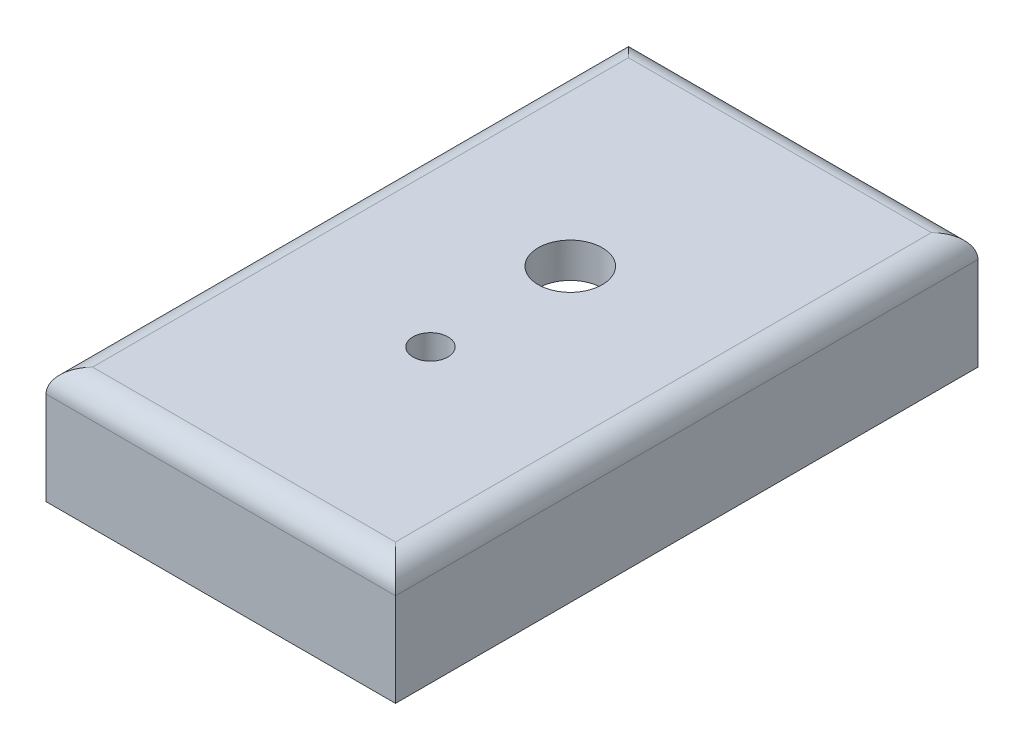
ISO-10303-21;
HEADER;
FILE_DESCRIPTION(('STEP AP214'),'2;1');
FILE_NAME('part.step','',(''),(''),'','','');
FILE_SCHEMA(('AUTOMOTIVE_DESIGN { 1 0 10303 214 1 1 1 1 }'));
ENDSEC;
DATA;
#1=APPLICATION_CONTEXT('core data for automotive mechanical design processes');
#2=APPLICATION_PROTOCOL_DEFINITION('international standard','automotive_design',2000,#1);
#3=PRODUCT_CONTEXT('',#1,'mechanical');
#4=PRODUCT('Part','Part','',(#3));
#5=PRODUCT_RELATED_PRODUCT_CATEGORY('part','',(#4));
#6=PRODUCT_DEFINITION_FORMATION('','',#4);
#7=PRODUCT_DEFINITION_CONTEXT('part definition',#1,'design');
#8=PRODUCT_DEFINITION('design','',#6,#7);
#9=PRODUCT_DEFINITION_SHAPE('','',#8);
#10=(LENGTH_UNIT() NAMED_UNIT(*) SI_UNIT(.MILLI.,.METRE.));
#11=(NAMED_UNIT(*) PLANE_ANGLE_UNIT() SI_UNIT($,.RADIAN.));
#12=(NAMED_UNIT(*) SI_UNIT($,.STERADIAN.) SOLID_ANGLE_UNIT());
#13=UNCERTAINTY_MEASURE_WITH_UNIT(LENGTH_MEASURE(1.E-05),#10,'distance_accuracy_value','');
#14=(GEOMETRIC_REPRESENTATION_CONTEXT(3) GLOBAL_UNCERTAINTY_ASSIGNED_CONTEXT((#13)) GLOBAL_UNIT_ASSIGNED_CONTEXT((#10,
#11,#12)) REPRESENTATION_CONTEXT('',''));
#15=CARTESIAN_POINT('',(0.,0.,0.));
#16=DIRECTION('',(0.,0.,1.));
#17=DIRECTION('',(1.,0.,0.));
#18=AXIS2_PLACEMENT_3D('',#15,#16,#17);
#19=CARTESIAN_POINT('',(0.,7.,0.));
#20=DIRECTION('',(0.,-1.,0.));
#21=DIRECTION('',(0.,0.,-1.));
#22=AXIS2_PLACEMENT_3D('',#19,#20,#21);
#23=PLANE('',#22);
#24=DIRECTION('',(0.,0.,-1.));
#25=VECTOR('',#24,1.);
#26=CARTESIAN_POINT('',(12.,7.,0.));
#27=LINE('',#26,#25);
#28=CARTESIAN_POINT('',(12.,7.,22.));
#29=VERTEX_POINT('',#28);
#30=CARTESIAN_POINT('',(12.,7.,-22.));
#31=VERTEX_POINT('',#30);
#32=EDGE_CURVE('E170',#29,#31,#27,.T.);
#33=ORIENTED_EDGE('',*,*,#32,.F.);
#34=DIRECTION('',(1.,0.,0.));
#35=VECTOR('',#34,1.);
#36=CARTESIAN_POINT('',(0.,7.,22.));
#37=LINE('',#36,#35);
#38=CARTESIAN_POINT('',(-12.,7.,22.));
#39=VERTEX_POINT('',#38);
#40=EDGE_CURVE('E208',#39,#29,#37,.T.);
#41=ORIENTED_EDGE('',*,*,#40,.F.);
#42=DIRECTION('',(0.,0.,1.));
#43=VECTOR('',#42,1.);
#44=CARTESIAN_POINT('',(-12.,7.,0.));
#45=LINE('',#44,#43);
#46=CARTESIAN_POINT('',(-12.,7.,-22.));
#47=VERTEX_POINT('',#46);
#48=EDGE_CURVE('E171',#47,#39,#45,.T.);
#49=ORIENTED_EDGE('',*,*,#48,.F.);
#50=DIRECTION('',(-1.,0.,0.));
#51=VECTOR('',#50,1.);
#52=CARTESIAN_POINT('',(0.,7.,-22.));
#53=LINE('',#52,#51);
#54=EDGE_CURVE('E166',#31,#47,#53,.T.);
#55=ORIENTED_EDGE('',*,*,#54,.F.);
#56=EDGE_LOOP('',(#33,#41,#49,#55));
#57=FACE_BOUND('',#56,.T.);
#58=CARTESIAN_POINT('',(0.,7.,7.00000000000001));
#59=DIRECTION('',(0.,-1.,0.));
#60=DIRECTION('',(0.,0.,-1.));
#61=AXIS2_PLACEMENT_3D('',#58,#59,#60);
#62=CIRCLE('',#61,1.5);
#63=CARTESIAN_POINT('',(0.,7.,5.50000000000001));
#64=VERTEX_POINT('',#63);
#65=EDGE_CURVE('E376',#64,#64,#62,.F.);
#66=ORIENTED_EDGE('',*,*,#65,.T.);
#67=EDGE_LOOP('',(#66));
#68=FACE_BOUND('',#67,.T.);
#69=CARTESIAN_POINT('',(0.,7.,-4.99999999999999));
#70=DIRECTION('',(0.,-1.,0.));
#71=DIRECTION('',(0.,0.,-1.));
#72=AXIS2_PLACEMENT_3D('',#69,#70,#71);
#73=CIRCLE('',#72,2.75);
#74=CARTESIAN_POINT('',(0.,7.,-7.74999999999999));
#75=VERTEX_POINT('',#74);
#76=EDGE_CURVE('E204',#75,#75,#73,.F.);
#77=ORIENTED_EDGE('',*,*,#76,.T.);
#78=EDGE_LOOP('',(#77));
#79=FACE_BOUND('',#78,.T.);
#80=ADVANCED_FACE('F39',(#57,#68,#79),#23,.T.);
#81=CARTESIAN_POINT('',(0.,0.,0.));
#82=DIRECTION('',(0.,-1.,0.));
#83=DIRECTION('',(0.,0.,-1.));
#84=AXIS2_PLACEMENT_3D('',#81,#82,#83);
#85=PLANE('',#84);
#86=DIRECTION('',(0.,0.,1.));
#87=VECTOR('',#86,1.);
#88=CARTESIAN_POINT('',(-15.,0.,25.));
#89=LINE('',#88,#87);
#90=CARTESIAN_POINT('',(-15.,0.,12.));
#91=VERTEX_POINT('',#90);
#92=CARTESIAN_POINT('',(-15.,0.,25.));
#93=VERTEX_POINT('',#92);
#94=EDGE_CURVE('E234',#91,#93,#89,.T.);
#95=ORIENTED_EDGE('',*,*,#94,.F.);
#96=DIRECTION('',(-1.,0.,0.));
#97=VECTOR('',#96,1.);
#98=CARTESIAN_POINT('',(-12.,0.,12.));
#99=LINE('',#98,#97);
#100=CARTESIAN_POINT('',(-12.,0.,12.));
#101=VERTEX_POINT('',#100);
#102=EDGE_CURVE('E279',#91,#101,#99,.F.);
#103=ORIENTED_EDGE('',*,*,#102,.T.);
#104=DIRECTION('',(0.,0.,1.));
#105=VECTOR('',#104,1.);
#106=CARTESIAN_POINT('',(-12.,0.,0.));
#107=LINE('',#106,#105);
#108=CARTESIAN_POINT('',(-12.,0.,22.));
#109=VERTEX_POINT('',#108);
#110=EDGE_CURVE('E228',#101,#109,#107,.T.);
#111=ORIENTED_EDGE('',*,*,#110,.T.);
#112=DIRECTION('',(1.,0.,0.));
#113=VECTOR('',#112,1.);
#114=CARTESIAN_POINT('',(0.,0.,22.));
#115=LINE('',#114,#113);
#116=CARTESIAN_POINT('',(12.,0.,22.));
#117=VERTEX_POINT('',#116);
#118=EDGE_CURVE('E187',#109,#117,#115,.T.);
#119=ORIENTED_EDGE('',*,*,#118,.T.);
#120=DIRECTION('',(0.,0.,-1.));
#121=VECTOR('',#120,1.);
#122=CARTESIAN_POINT('',(12.,0.,0.));
#123=LINE('',#122,#121);
#124=CARTESIAN_POINT('',(12.,0.,-22.));
#125=VERTEX_POINT('',#124);
#126=EDGE_CURVE('E217',#117,#125,#123,.T.);
#127=ORIENTED_EDGE('',*,*,#126,.T.);
#128=DIRECTION('',(-1.,0.,0.));
#129=VECTOR('',#128,1.);
#130=CARTESIAN_POINT('',(0.,0.,-22.));
#131=LINE('',#130,#129);
#132=CARTESIAN_POINT('',(-12.,0.,-22.));
#133=VERTEX_POINT('',#132);
#134=EDGE_CURVE('E191',#125,#133,#131,.T.);
#135=ORIENTED_EDGE('',*,*,#134,.T.);
#136=CARTESIAN_POINT('',(-12.,0.,-12.));
#137=VERTEX_POINT('',#136);
#138=EDGE_CURVE('E224',#133,#137,#107,.T.);
#139=ORIENTED_EDGE('',*,*,#138,.T.);
#140=DIRECTION('',(-1.,0.,0.));
#141=VECTOR('',#140,1.);
#142=CARTESIAN_POINT('',(-15.,0.,-12.));
#143=LINE('',#142,#141);
#144=CARTESIAN_POINT('',(-15.,0.,-12.));
#145=VERTEX_POINT('',#144);
#146=EDGE_CURVE('E275',#137,#145,#143,.T.);
#147=ORIENTED_EDGE('',*,*,#146,.T.);
#148=CARTESIAN_POINT('',(-15.,0.,-25.));
#149=VERTEX_POINT('',#148);
#150=EDGE_CURVE('E235',#149,#145,#89,.T.);
#151=ORIENTED_EDGE('',*,*,#150,.F.);
#152=DIRECTION('',(-1.,0.,0.));
#153=VECTOR('',#152,1.);
#154=CARTESIAN_POINT('',(-15.,0.,-25.));
#155=LINE('',#154,#153);
#156=CARTESIAN_POINT('',(15.,0.,-25.));
#157=VERTEX_POINT('',#156);
#158=EDGE_CURVE('E199',#157,#149,#155,.T.);
#159=ORIENTED_EDGE('',*,*,#158,.F.);
#160=DIRECTION('',(0.,0.,-1.));
#161=VECTOR('',#160,1.);
#162=CARTESIAN_POINT('',(15.,0.,25.));
#163=LINE('',#162,#161);
#164=CARTESIAN_POINT('',(15.,0.,25.));
#165=VERTEX_POINT('',#164);
#166=EDGE_CURVE('E193',#165,#157,#163,.T.);
#167=ORIENTED_EDGE('',*,*,#166,.F.);
#168=DIRECTION('',(1.,0.,0.));
#169=VECTOR('',#168,1.);
#170=CARTESIAN_POINT('',(-15.,0.,25.));
#171=LINE('',#170,#169);
#172=EDGE_CURVE('E239',#93,#165,#171,.T.);
#173=ORIENTED_EDGE('',*,*,#172,.F.);
#174=EDGE_LOOP('',(#95,#103,#111,#119,#127,#135,#139,#147,#151,#159,#167,#173));
#175=FACE_BOUND('',#174,.T.);
#176=ADVANCED_FACE('F406',(#175),#85,.T.);
#177=CARTESIAN_POINT('',(15.,10.,25.));
#178=DIRECTION('',(-1.,0.,0.));
#179=DIRECTION('',(0.,0.,1.));
#180=AXIS2_PLACEMENT_3D('',#177,#178,#179);
#181=PLANE('',#180);
#182=DIRECTION('',(0.,-1.,0.));
#183=VECTOR('',#182,1.);
#184=CARTESIAN_POINT('',(15.,10.,-25.));
#185=LINE('',#184,#183);
#186=CARTESIAN_POINT('',(15.,8.,-25.));
#187=VERTEX_POINT('',#186);
#188=EDGE_CURVE('E252',#187,#157,#185,.T.);
#189=ORIENTED_EDGE('',*,*,#188,.F.);
#190=DIRECTION('',(0.,0.,-1.));
#191=VECTOR('',#190,1.);
#192=CARTESIAN_POINT('',(15.,8.,25.));
#193=LINE('',#192,#191);
#194=CARTESIAN_POINT('',(15.,8.,25.));
#195=VERTEX_POINT('',#194);
#196=EDGE_CURVE('E63',#187,#195,#193,.F.);
#197=ORIENTED_EDGE('',*,*,#196,.T.);
#198=DIRECTION('',(0.,-1.,0.));
#199=VECTOR('',#198,1.);
#200=CARTESIAN_POINT('',(15.,10.,25.));
#201=LINE('',#200,#199);
#202=EDGE_CURVE('E243',#195,#165,#201,.T.);
#203=ORIENTED_EDGE('',*,*,#202,.T.);
#204=ORIENTED_EDGE('',*,*,#166,.T.);
#205=EDGE_LOOP('',(#189,#197,#203,#204));
#206=FACE_BOUND('',#205,.T.);
#207=ADVANCED_FACE('F411',(#206),#181,.F.);
#208=CARTESIAN_POINT('',(-15.,10.,-25.));
#209=DIRECTION('',(0.,0.,1.));
#210=DIRECTION('',(1.,0.,0.));
#211=AXIS2_PLACEMENT_3D('',#208,#209,#210);
#212=PLANE('',#211);
#213=DIRECTION('',(0.,-1.,0.));
#214=VECTOR('',#213,1.);
#215=CARTESIAN_POINT('',(-15.,10.,-25.));
#216=LINE('',#215,#214);
#217=CARTESIAN_POINT('',(-15.,8.,-25.));
#218=VERTEX_POINT('',#217);
#219=EDGE_CURVE('E249',#218,#149,#216,.T.);
#220=ORIENTED_EDGE('',*,*,#219,.F.);
#221=DIRECTION('',(-1.,0.,0.));
#222=VECTOR('',#221,1.);
#223=CARTESIAN_POINT('',(-15.,8.,-25.));
#224=LINE('',#223,#222);
#225=EDGE_CURVE('E320',#218,#187,#224,.F.);
#226=ORIENTED_EDGE('',*,*,#225,.T.);
#227=ORIENTED_EDGE('',*,*,#188,.T.);
#228=ORIENTED_EDGE('',*,*,#158,.T.);
#229=EDGE_LOOP('',(#220,#226,#227,#228));
#230=FACE_BOUND('',#229,.T.);
#231=ADVANCED_FACE('F427',(#230),#212,.F.);
#232=CARTESIAN_POINT('',(-15.,10.,25.));
#233=DIRECTION('',(1.,0.,0.));
#234=DIRECTION('',(0.,0.,-1.));
#235=AXIS2_PLACEMENT_3D('',#232,#233,#234);
#236=PLANE('',#235);
#237=DIRECTION('',(0.,-1.,0.));
#238=VECTOR('',#237,1.);
#239=CARTESIAN_POINT('',(-15.,10.,25.));
#240=LINE('',#239,#238);
#241=CARTESIAN_POINT('',(-15.,8.,25.));
#242=VERTEX_POINT('',#241);
#243=EDGE_CURVE('E246',#242,#93,#240,.T.);
#244=ORIENTED_EDGE('',*,*,#243,.F.);
#245=DIRECTION('',(0.,0.,1.));
#246=VECTOR('',#245,1.);
#247=CARTESIAN_POINT('',(-15.,8.,25.));
#248=LINE('',#247,#246);
#249=EDGE_CURVE('E49',#242,#218,#248,.F.);
#250=ORIENTED_EDGE('',*,*,#249,.T.);
#251=ORIENTED_EDGE('',*,*,#219,.T.);
#252=ORIENTED_EDGE('',*,*,#150,.T.);
#253=CARTESIAN_POINT('',(-15.,2.,-12.));
#254=DIRECTION('',(1.,0.,0.));
#255=DIRECTION('',(0.,0.,-1.));
#256=AXIS2_PLACEMENT_3D('',#253,#254,#255);
#257=CIRCLE('',#256,2.);
#258=CARTESIAN_POINT('',(-15.,2.,-10.));
#259=VERTEX_POINT('',#258);
#260=EDGE_CURVE('E269',#145,#259,#257,.F.);
#261=ORIENTED_EDGE('',*,*,#260,.T.);
#262=DIRECTION('',(0.,-1.,0.));
#263=VECTOR('',#262,1.);
#264=CARTESIAN_POINT('',(-15.,5.,-10.));
#265=LINE('',#264,#263);
#266=CARTESIAN_POINT('',(-15.,3.,-10.));
#267=VERTEX_POINT('',#266);
#268=EDGE_CURVE('E365',#267,#259,#265,.T.);
#269=ORIENTED_EDGE('',*,*,#268,.F.);
#270=CARTESIAN_POINT('',(-15.,3.,-8.));
#271=DIRECTION('',(1.,0.,0.));
#272=DIRECTION('',(0.,0.,-1.));
#273=AXIS2_PLACEMENT_3D('',#270,#271,#272);
#274=CIRCLE('',#273,2.);
#275=CARTESIAN_POINT('',(-15.,5.,-8.));
#276=VERTEX_POINT('',#275);
#277=EDGE_CURVE('E301',#267,#276,#274,.T.);
#278=ORIENTED_EDGE('',*,*,#277,.T.);
#279=DIRECTION('',(0.,0.,-1.));
#280=VECTOR('',#279,1.);
#281=CARTESIAN_POINT('',(-15.,5.,-10.));
#282=LINE('',#281,#280);
#283=CARTESIAN_POINT('',(-15.,5.,8.00000000000001));
#284=VERTEX_POINT('',#283);
#285=EDGE_CURVE('E361',#284,#276,#282,.T.);
#286=ORIENTED_EDGE('',*,*,#285,.F.);
#287=CARTESIAN_POINT('',(-15.,3.,8.00000000000001));
#288=DIRECTION('',(1.,0.,0.));
#289=DIRECTION('',(0.,0.,-1.));
#290=AXIS2_PLACEMENT_3D('',#287,#288,#289);
#291=CIRCLE('',#290,2.);
#292=CARTESIAN_POINT('',(-15.,3.,10.));
#293=VERTEX_POINT('',#292);
#294=EDGE_CURVE('E295',#284,#293,#291,.T.);
#295=ORIENTED_EDGE('',*,*,#294,.T.);
#296=DIRECTION('',(0.,1.,0.));
#297=VECTOR('',#296,1.);
#298=CARTESIAN_POINT('',(-15.,5.,10.));
#299=LINE('',#298,#297);
#300=CARTESIAN_POINT('',(-15.,2.,10.));
#301=VERTEX_POINT('',#300);
#302=EDGE_CURVE('E355',#301,#293,#299,.T.);
#303=ORIENTED_EDGE('',*,*,#302,.F.);
#304=CARTESIAN_POINT('',(-15.,2.,12.));
#305=DIRECTION('',(1.,0.,0.));
#306=DIRECTION('',(0.,0.,-1.));
#307=AXIS2_PLACEMENT_3D('',#304,#305,#306);
#308=CIRCLE('',#307,2.);
#309=EDGE_CURVE('E272',#301,#91,#308,.F.);
#310=ORIENTED_EDGE('',*,*,#309,.T.);
#311=ORIENTED_EDGE('',*,*,#94,.T.);
#312=EDGE_LOOP('',(#244,#250,#251,#252,#261,#269,#278,#286,#295,#303,#310,#311));
#313=FACE_BOUND('',#312,.T.);
#314=ADVANCED_FACE('F424',(#313),#236,.F.);
#315=CARTESIAN_POINT('',(-15.,10.,25.));
#316=DIRECTION('',(0.,0.,-1.));
#317=DIRECTION('',(-1.,0.,0.));
#318=AXIS2_PLACEMENT_3D('',#315,#316,#317);
#319=PLANE('',#318);
#320=ORIENTED_EDGE('',*,*,#202,.F.);
#321=DIRECTION('',(1.,0.,0.));
#322=VECTOR('',#321,1.);
#323=CARTESIAN_POINT('',(-15.,8.,25.));
#324=LINE('',#323,#322);
#325=EDGE_CURVE('E11',#195,#242,#324,.F.);
#326=ORIENTED_EDGE('',*,*,#325,.T.);
#327=ORIENTED_EDGE('',*,*,#243,.T.);
#328=ORIENTED_EDGE('',*,*,#172,.T.);
#329=EDGE_LOOP('',(#320,#326,#327,#328));
#330=FACE_BOUND('',#329,.T.);
#331=ADVANCED_FACE('F419',(#330),#319,.F.);
#332=CARTESIAN_POINT('',(0.,10.,0.));
#333=DIRECTION('',(0.,-1.,0.));
#334=DIRECTION('',(0.,0.,-1.));
#335=AXIS2_PLACEMENT_3D('',#332,#333,#334);
#336=PLANE('',#335);
#337=DIRECTION('',(0.,0.,-1.));
#338=VECTOR('',#337,1.);
#339=CARTESIAN_POINT('',(13.,10.,0.));
#340=LINE('',#339,#338);
#341=CARTESIAN_POINT('',(13.,10.,23.));
#342=VERTEX_POINT('',#341);
#343=CARTESIAN_POINT('',(13.,10.,-23.));
#344=VERTEX_POINT('',#343);
#345=EDGE_CURVE('E313',#342,#344,#340,.T.);
#346=ORIENTED_EDGE('',*,*,#345,.T.);
#347=DIRECTION('',(-1.,0.,0.));
#348=VECTOR('',#347,1.);
#349=CARTESIAN_POINT('',(0.,10.,-23.));
#350=LINE('',#349,#348);
#351=CARTESIAN_POINT('',(-13.,10.,-23.));
#352=VERTEX_POINT('',#351);
#353=EDGE_CURVE('E316',#344,#352,#350,.T.);
#354=ORIENTED_EDGE('',*,*,#353,.T.);
#355=DIRECTION('',(0.,0.,1.));
#356=VECTOR('',#355,1.);
#357=CARTESIAN_POINT('',(-13.,10.,0.));
#358=LINE('',#357,#356);
#359=CARTESIAN_POINT('',(-13.,10.,23.));
#360=VERTEX_POINT('',#359);
#361=EDGE_CURVE('E310',#352,#360,#358,.T.);
#362=ORIENTED_EDGE('',*,*,#361,.T.);
#363=DIRECTION('',(1.,0.,0.));
#364=VECTOR('',#363,1.);
#365=CARTESIAN_POINT('',(0.,10.,23.));
#366=LINE('',#365,#364);
#367=EDGE_CURVE('E307',#360,#342,#366,.T.);
#368=ORIENTED_EDGE('',*,*,#367,.T.);
#369=EDGE_LOOP('',(#346,#354,#362,#368));
#370=FACE_BOUND('',#369,.T.);
#371=CARTESIAN_POINT('',(0.,10.,7.00000000000001));
#372=DIRECTION('',(0.,1.,0.));
#373=DIRECTION('',(0.,0.,1.));
#374=AXIS2_PLACEMENT_3D('',#371,#372,#373);
#375=CIRCLE('',#374,1.5);
#376=CARTESIAN_POINT('',(0.,10.,8.50000000000001));
#377=VERTEX_POINT('',#376);
#378=EDGE_CURVE('E220',#377,#377,#375,.T.);
#379=ORIENTED_EDGE('',*,*,#378,.F.);
#380=EDGE_LOOP('',(#379));
#381=FACE_BOUND('',#380,.T.);
#382=CARTESIAN_POINT('',(0.,10.,-4.99999999999999));
#383=DIRECTION('',(0.,1.,0.));
#384=DIRECTION('',(0.,0.,1.));
#385=AXIS2_PLACEMENT_3D('',#382,#383,#384);
#386=CIRCLE('',#385,2.75);
#387=CARTESIAN_POINT('',(0.,10.,-2.25));
#388=VERTEX_POINT('',#387);
#389=EDGE_CURVE('E379',#388,#388,#386,.T.);
#390=ORIENTED_EDGE('',*,*,#389,.F.);
#391=EDGE_LOOP('',(#390));
#392=FACE_BOUND('',#391,.T.);
#393=ADVANCED_FACE('F417',(#370,#381,#392),#336,.F.);
#394=CARTESIAN_POINT('',(12.,10.,25.));
#395=DIRECTION('',(-1.,0.,0.));
#396=DIRECTION('',(0.,0.,1.));
#397=AXIS2_PLACEMENT_3D('',#394,#395,#396);
#398=PLANE('',#397);
#399=ORIENTED_EDGE('',*,*,#126,.F.);
#400=DIRECTION('',(0.,-1.,0.));
#401=VECTOR('',#400,1.);
#402=CARTESIAN_POINT('',(12.,10.,22.));
#403=LINE('',#402,#401);
#404=EDGE_CURVE('E185',#29,#117,#403,.T.);
#405=ORIENTED_EDGE('',*,*,#404,.F.);
#406=ORIENTED_EDGE('',*,*,#32,.T.);
#407=DIRECTION('',(0.,-1.,0.));
#408=VECTOR('',#407,1.);
#409=CARTESIAN_POINT('',(12.,10.,-22.));
#410=LINE('',#409,#408);
#411=EDGE_CURVE('E183',#31,#125,#410,.T.);
#412=ORIENTED_EDGE('',*,*,#411,.T.);
#413=EDGE_LOOP('',(#399,#405,#406,#412));
#414=FACE_BOUND('',#413,.T.);
#415=ADVANCED_FACE('F182',(#414),#398,.T.);
#416=CARTESIAN_POINT('',(-15.,10.,-22.));
#417=DIRECTION('',(0.,0.,1.));
#418=DIRECTION('',(1.,0.,0.));
#419=AXIS2_PLACEMENT_3D('',#416,#417,#418);
#420=PLANE('',#419);
#421=ORIENTED_EDGE('',*,*,#134,.F.);
#422=ORIENTED_EDGE('',*,*,#411,.F.);
#423=ORIENTED_EDGE('',*,*,#54,.T.);
#424=DIRECTION('',(0.,-1.,0.));
#425=VECTOR('',#424,1.);
#426=CARTESIAN_POINT('',(-12.,10.,-22.));
#427=LINE('',#426,#425);
#428=EDGE_CURVE('E194',#47,#133,#427,.T.);
#429=ORIENTED_EDGE('',*,*,#428,.T.);
#430=EDGE_LOOP('',(#421,#422,#423,#429));
#431=FACE_BOUND('',#430,.T.);
#432=ADVANCED_FACE('F189',(#431),#420,.T.);
#433=CARTESIAN_POINT('',(-12.,10.,25.));
#434=DIRECTION('',(1.,0.,0.));
#435=DIRECTION('',(0.,0.,-1.));
#436=AXIS2_PLACEMENT_3D('',#433,#434,#435);
#437=PLANE('',#436);
#438=ORIENTED_EDGE('',*,*,#110,.F.);
#439=CARTESIAN_POINT('',(-12.,2.,12.));
#440=DIRECTION('',(1.,0.,0.));
#441=DIRECTION('',(0.,0.,-1.));
#442=AXIS2_PLACEMENT_3D('',#439,#440,#441);
#443=CIRCLE('',#442,2.);
#444=CARTESIAN_POINT('',(-12.,2.,10.));
#445=VERTEX_POINT('',#444);
#446=EDGE_CURVE('E285',#101,#445,#443,.T.);
#447=ORIENTED_EDGE('',*,*,#446,.T.);
#448=DIRECTION('',(0.,1.,0.));
#449=VECTOR('',#448,1.);
#450=CARTESIAN_POINT('',(-12.,5.,10.));
#451=LINE('',#450,#449);
#452=CARTESIAN_POINT('',(-12.,3.,10.));
#453=VERTEX_POINT('',#452);
#454=EDGE_CURVE('E348',#445,#453,#451,.T.);
#455=ORIENTED_EDGE('',*,*,#454,.T.);
#456=CARTESIAN_POINT('',(-12.,3.,8.00000000000001));
#457=DIRECTION('',(1.,0.,0.));
#458=DIRECTION('',(0.,0.,-1.));
#459=AXIS2_PLACEMENT_3D('',#456,#457,#458);
#460=CIRCLE('',#459,2.);
#461=CARTESIAN_POINT('',(-12.,5.,8.00000000000001));
#462=VERTEX_POINT('',#461);
#463=EDGE_CURVE('E298',#453,#462,#460,.F.);
#464=ORIENTED_EDGE('',*,*,#463,.T.);
#465=DIRECTION('',(0.,0.,-1.));
#466=VECTOR('',#465,1.);
#467=CARTESIAN_POINT('',(-12.,5.,-10.));
#468=LINE('',#467,#466);
#469=CARTESIAN_POINT('',(-12.,5.,-8.));
#470=VERTEX_POINT('',#469);
#471=EDGE_CURVE('E369',#462,#470,#468,.T.);
#472=ORIENTED_EDGE('',*,*,#471,.T.);
#473=CARTESIAN_POINT('',(-12.,3.,-8.));
#474=DIRECTION('',(1.,0.,0.));
#475=DIRECTION('',(0.,0.,-1.));
#476=AXIS2_PLACEMENT_3D('',#473,#474,#475);
#477=CIRCLE('',#476,2.);
#478=CARTESIAN_POINT('',(-12.,3.,-10.));
#479=VERTEX_POINT('',#478);
#480=EDGE_CURVE('E304',#470,#479,#477,.F.);
#481=ORIENTED_EDGE('',*,*,#480,.T.);
#482=DIRECTION('',(0.,-1.,0.));
#483=VECTOR('',#482,1.);
#484=CARTESIAN_POINT('',(-12.,5.,-10.));
#485=LINE('',#484,#483);
#486=CARTESIAN_POINT('',(-12.,2.,-10.));
#487=VERTEX_POINT('',#486);
#488=EDGE_CURVE('E342',#479,#487,#485,.T.);
#489=ORIENTED_EDGE('',*,*,#488,.T.);
#490=CARTESIAN_POINT('',(-12.,2.,-12.));
#491=DIRECTION('',(1.,0.,0.));
#492=DIRECTION('',(0.,0.,-1.));
#493=AXIS2_PLACEMENT_3D('',#490,#491,#492);
#494=CIRCLE('',#493,2.);
#495=EDGE_CURVE('E282',#487,#137,#494,.T.);
#496=ORIENTED_EDGE('',*,*,#495,.T.);
#497=ORIENTED_EDGE('',*,*,#138,.F.);
#498=ORIENTED_EDGE('',*,*,#428,.F.);
#499=ORIENTED_EDGE('',*,*,#48,.T.);
#500=DIRECTION('',(0.,-1.,0.));
#501=VECTOR('',#500,1.);
#502=CARTESIAN_POINT('',(-12.,10.,22.));
#503=LINE('',#502,#501);
#504=EDGE_CURVE('E201',#39,#109,#503,.T.);
#505=ORIENTED_EDGE('',*,*,#504,.T.);
#506=EDGE_LOOP('',(#438,#447,#455,#464,#472,#481,#489,#496,#497,#498,#499,#505));
#507=FACE_BOUND('',#506,.T.);
#508=ADVANCED_FACE('F486',(#507),#437,.T.);
#509=CARTESIAN_POINT('',(-15.,10.,22.));
#510=DIRECTION('',(0.,0.,-1.));
#511=DIRECTION('',(-1.,0.,0.));
#512=AXIS2_PLACEMENT_3D('',#509,#510,#511);
#513=PLANE('',#512);
#514=ORIENTED_EDGE('',*,*,#118,.F.);
#515=ORIENTED_EDGE('',*,*,#504,.F.);
#516=ORIENTED_EDGE('',*,*,#40,.T.);
#517=ORIENTED_EDGE('',*,*,#404,.T.);
#518=EDGE_LOOP('',(#514,#515,#516,#517));
#519=FACE_BOUND('',#518,.T.);
#520=ADVANCED_FACE('F401',(#519),#513,.T.);
#521=CARTESIAN_POINT('',(0.,-0.000999999999999265,7.00000000000001));
#522=DIRECTION('',(0.,1.,0.));
#523=DIRECTION('',(0.,0.,1.));
#524=AXIS2_PLACEMENT_3D('',#521,#522,#523);
#525=CYLINDRICAL_SURFACE('',#524,1.5);
#526=ORIENTED_EDGE('',*,*,#65,.F.);
#527=EDGE_LOOP('',(#526));
#528=FACE_BOUND('',#527,.T.);
#529=ORIENTED_EDGE('',*,*,#378,.T.);
#530=EDGE_LOOP('',(#529));
#531=FACE_BOUND('',#530,.T.);
#532=ADVANCED_FACE('F392',(#528,#531),#525,.F.);
#533=CARTESIAN_POINT('',(0.,-0.000999999999999265,-4.99999999999999));
#534=DIRECTION('',(0.,1.,0.));
#535=DIRECTION('',(0.,0.,1.));
#536=AXIS2_PLACEMENT_3D('',#533,#534,#535);
#537=CYLINDRICAL_SURFACE('',#536,2.75);
#538=ORIENTED_EDGE('',*,*,#76,.F.);
#539=EDGE_LOOP('',(#538));
#540=FACE_BOUND('',#539,.T.);
#541=ORIENTED_EDGE('',*,*,#389,.T.);
#542=EDGE_LOOP('',(#541));
#543=FACE_BOUND('',#542,.T.);
#544=ADVANCED_FACE('F389',(#540,#543),#537,.F.);
#545=CARTESIAN_POINT('',(15.001,5.,-10.));
#546=DIRECTION('',(0.,1.,0.));
#547=DIRECTION('',(0.,0.,1.));
#548=AXIS2_PLACEMENT_3D('',#545,#546,#547);
#549=PLANE('',#548);
#550=ORIENTED_EDGE('',*,*,#471,.F.);
#551=DIRECTION('',(-1.,0.,0.));
#552=VECTOR('',#551,1.);
#553=CARTESIAN_POINT('',(-15.,5.,8.00000000000001));
#554=LINE('',#553,#552);
#555=EDGE_CURVE('E258',#462,#284,#554,.T.);
#556=ORIENTED_EDGE('',*,*,#555,.T.);
#557=ORIENTED_EDGE('',*,*,#285,.T.);
#558=DIRECTION('',(-1.,0.,0.));
#559=VECTOR('',#558,1.);
#560=CARTESIAN_POINT('',(-12.,5.,-8.));
#561=LINE('',#560,#559);
#562=EDGE_CURVE('E255',#276,#470,#561,.F.);
#563=ORIENTED_EDGE('',*,*,#562,.T.);
#564=EDGE_LOOP('',(#550,#556,#557,#563));
#565=FACE_BOUND('',#564,.T.);
#566=ADVANCED_FACE('F391',(#565),#549,.F.);
#567=CARTESIAN_POINT('',(15.001,5.,-10.));
#568=DIRECTION('',(0.,0.,-1.));
#569=DIRECTION('',(0.,1.,0.));
#570=AXIS2_PLACEMENT_3D('',#567,#568,#569);
#571=PLANE('',#570);
#572=ORIENTED_EDGE('',*,*,#488,.F.);
#573=DIRECTION('',(-1.,0.,0.));
#574=VECTOR('',#573,1.);
#575=CARTESIAN_POINT('',(-15.,3.,-10.));
#576=LINE('',#575,#574);
#577=EDGE_CURVE('E291',#479,#267,#576,.T.);
#578=ORIENTED_EDGE('',*,*,#577,.T.);
#579=ORIENTED_EDGE('',*,*,#268,.T.);
#580=DIRECTION('',(-1.,0.,0.));
#581=VECTOR('',#580,1.);
#582=CARTESIAN_POINT('',(-12.,2.,-10.));
#583=LINE('',#582,#581);
#584=EDGE_CURVE('E288',#259,#487,#583,.F.);
#585=ORIENTED_EDGE('',*,*,#584,.T.);
#586=EDGE_LOOP('',(#572,#578,#579,#585));
#587=FACE_BOUND('',#586,.T.);
#588=ADVANCED_FACE('F398',(#587),#571,.F.);
#589=CARTESIAN_POINT('',(15.001,5.,10.));
#590=DIRECTION('',(0.,0.,1.));
#591=DIRECTION('',(0.,-1.,0.));
#592=AXIS2_PLACEMENT_3D('',#589,#590,#591);
#593=PLANE('',#592);
#594=ORIENTED_EDGE('',*,*,#302,.T.);
#595=DIRECTION('',(-1.,0.,0.));
#596=VECTOR('',#595,1.);
#597=CARTESIAN_POINT('',(-12.,3.,10.));
#598=LINE('',#597,#596);
#599=EDGE_CURVE('E266',#293,#453,#598,.F.);
#600=ORIENTED_EDGE('',*,*,#599,.T.);
#601=ORIENTED_EDGE('',*,*,#454,.F.);
#602=DIRECTION('',(-1.,0.,0.));
#603=VECTOR('',#602,1.);
#604=CARTESIAN_POINT('',(-15.,2.,10.));
#605=LINE('',#604,#603);
#606=EDGE_CURVE('E262',#445,#301,#605,.T.);
#607=ORIENTED_EDGE('',*,*,#606,.T.);
#608=EDGE_LOOP('',(#594,#600,#601,#607));
#609=FACE_BOUND('',#608,.T.);
#610=ADVANCED_FACE('F438',(#609),#593,.F.);
#611=CARTESIAN_POINT('',(15.001,3.,8.00000000000001));
#612=DIRECTION('',(1.,0.,0.));
#613=DIRECTION('',(0.,0.,-1.));
#614=AXIS2_PLACEMENT_3D('',#611,#612,#613);
#615=CYLINDRICAL_SURFACE('',#614,2.);
#616=ORIENTED_EDGE('',*,*,#463,.F.);
#617=ORIENTED_EDGE('',*,*,#599,.F.);
#618=ORIENTED_EDGE('',*,*,#294,.F.);
#619=ORIENTED_EDGE('',*,*,#555,.F.);
#620=EDGE_LOOP('',(#616,#617,#618,#619));
#621=FACE_BOUND('',#620,.T.);
#622=ADVANCED_FACE('F434',(#621),#615,.F.);
#623=CARTESIAN_POINT('',(15.001,2.,12.));
#624=DIRECTION('',(1.,0.,0.));
#625=DIRECTION('',(0.,0.,-1.));
#626=AXIS2_PLACEMENT_3D('',#623,#624,#625);
#627=CYLINDRICAL_SURFACE('',#626,2.);
#628=ORIENTED_EDGE('',*,*,#446,.F.);
#629=ORIENTED_EDGE('',*,*,#102,.F.);
#630=ORIENTED_EDGE('',*,*,#309,.F.);
#631=ORIENTED_EDGE('',*,*,#606,.F.);
#632=EDGE_LOOP('',(#628,#629,#630,#631));
#633=FACE_BOUND('',#632,.T.);
#634=ADVANCED_FACE('F437',(#633),#627,.T.);
#635=CARTESIAN_POINT('',(15.001,3.,-8.));
#636=DIRECTION('',(1.,0.,0.));
#637=DIRECTION('',(0.,0.,-1.));
#638=AXIS2_PLACEMENT_3D('',#635,#636,#637);
#639=CYLINDRICAL_SURFACE('',#638,2.);
#640=ORIENTED_EDGE('',*,*,#480,.F.);
#641=ORIENTED_EDGE('',*,*,#562,.F.);
#642=ORIENTED_EDGE('',*,*,#277,.F.);
#643=ORIENTED_EDGE('',*,*,#577,.F.);
#644=EDGE_LOOP('',(#640,#641,#642,#643));
#645=FACE_BOUND('',#644,.T.);
#646=ADVANCED_FACE('F442',(#645),#639,.F.);
#647=CARTESIAN_POINT('',(0.,2.,-12.));
#648=DIRECTION('',(1.,0.,0.));
#649=DIRECTION('',(0.,0.,-1.));
#650=AXIS2_PLACEMENT_3D('',#647,#648,#649);
#651=CYLINDRICAL_SURFACE('',#650,2.);
#652=ORIENTED_EDGE('',*,*,#495,.F.);
#653=ORIENTED_EDGE('',*,*,#584,.F.);
#654=ORIENTED_EDGE('',*,*,#260,.F.);
#655=ORIENTED_EDGE('',*,*,#146,.F.);
#656=EDGE_LOOP('',(#652,#653,#654,#655));
#657=FACE_BOUND('',#656,.T.);
#658=ADVANCED_FACE('F446',(#657),#651,.T.);
#659=CARTESIAN_POINT('',(0.,8.,23.));
#660=DIRECTION('',(1.,0.,0.));
#661=DIRECTION('',(0.,0.,-1.));
#662=AXIS2_PLACEMENT_3D('',#659,#660,#661);
#663=CYLINDRICAL_SURFACE('',#662,2.);
#664=CARTESIAN_POINT('',(-13.,8.,23.));
#665=DIRECTION('',(0.707106781186547,0.,0.707106781186547));
#666=DIRECTION('',(0.707106781186547,0.,-0.707106781186547));
#667=AXIS2_PLACEMENT_3D('',#664,#665,#666);
#668=ELLIPSE('',#667,2.82842712474619,2.);
#669=EDGE_CURVE('E333',#242,#360,#668,.F.);
#670=ORIENTED_EDGE('',*,*,#669,.F.);
#671=ORIENTED_EDGE('',*,*,#325,.F.);
#672=CARTESIAN_POINT('',(13.,8.,23.));
#673=DIRECTION('',(0.707106781186547,0.,-0.707106781186547));
#674=DIRECTION('',(0.707106781186547,0.,0.707106781186547));
#675=AXIS2_PLACEMENT_3D('',#672,#673,#674);
#676=ELLIPSE('',#675,2.82842712474619,2.);
#677=EDGE_CURVE('E43',#342,#195,#676,.T.);
#678=ORIENTED_EDGE('',*,*,#677,.F.);
#679=ORIENTED_EDGE('',*,*,#367,.F.);
#680=EDGE_LOOP('',(#670,#671,#678,#679));
#681=FACE_BOUND('',#680,.T.);
#682=ADVANCED_FACE('F41',(#681),#663,.T.);
#683=CARTESIAN_POINT('',(13.,8.,0.));
#684=DIRECTION('',(0.,0.,-1.));
#685=DIRECTION('',(-1.,0.,0.));
#686=AXIS2_PLACEMENT_3D('',#683,#684,#685);
#687=CYLINDRICAL_SURFACE('',#686,2.);
#688=ORIENTED_EDGE('',*,*,#677,.T.);
#689=ORIENTED_EDGE('',*,*,#196,.F.);
#690=CARTESIAN_POINT('',(13.,8.,-23.));
#691=DIRECTION('',(-0.707106781186547,0.,-0.707106781186547));
#692=DIRECTION('',(0.707106781186547,0.,-0.707106781186547));
#693=AXIS2_PLACEMENT_3D('',#690,#691,#692);
#694=ELLIPSE('',#693,2.82842712474619,2.);
#695=EDGE_CURVE('E331',#344,#187,#694,.T.);
#696=ORIENTED_EDGE('',*,*,#695,.F.);
#697=ORIENTED_EDGE('',*,*,#345,.F.);
#698=EDGE_LOOP('',(#688,#689,#696,#697));
#699=FACE_BOUND('',#698,.T.);
#700=ADVANCED_FACE('F457',(#699),#687,.T.);
#701=CARTESIAN_POINT('',(-13.,8.,0.));
#702=DIRECTION('',(0.,0.,1.));
#703=DIRECTION('',(1.,0.,0.));
#704=AXIS2_PLACEMENT_3D('',#701,#702,#703);
#705=CYLINDRICAL_SURFACE('',#704,2.);
#706=ORIENTED_EDGE('',*,*,#669,.T.);
#707=ORIENTED_EDGE('',*,*,#361,.F.);
#708=CARTESIAN_POINT('',(-13.,8.,-23.));
#709=DIRECTION('',(-0.707106781186547,0.,0.707106781186547));
#710=DIRECTION('',(0.707106781186547,0.,0.707106781186547));
#711=AXIS2_PLACEMENT_3D('',#708,#709,#710);
#712=ELLIPSE('',#711,2.82842712474619,2.);
#713=EDGE_CURVE('E328',#218,#352,#712,.F.);
#714=ORIENTED_EDGE('',*,*,#713,.F.);
#715=ORIENTED_EDGE('',*,*,#249,.F.);
#716=EDGE_LOOP('',(#706,#707,#714,#715));
#717=FACE_BOUND('',#716,.T.);
#718=ADVANCED_FACE('F454',(#717),#705,.T.);
#719=CARTESIAN_POINT('',(0.,8.,-23.));
#720=DIRECTION('',(-1.,0.,0.));
#721=DIRECTION('',(0.,0.,1.));
#722=AXIS2_PLACEMENT_3D('',#719,#720,#721);
#723=CYLINDRICAL_SURFACE('',#722,2.);
#724=ORIENTED_EDGE('',*,*,#695,.T.);
#725=ORIENTED_EDGE('',*,*,#225,.F.);
#726=ORIENTED_EDGE('',*,*,#713,.T.);
#727=ORIENTED_EDGE('',*,*,#353,.F.);
#728=EDGE_LOOP('',(#724,#725,#726,#727));
#729=FACE_BOUND('',#728,.T.);
#730=ADVANCED_FACE('F451',(#729),#723,.T.);
#731=CLOSED_SHELL('',(#80,#176,#207,#231,#314,#331,#393,#415,#432,#508,#520,#532,#544,#566,#588,
#610,#622,#634,#646,#658,#682,#700,#718,#730));
#732=MANIFOLD_SOLID_BREP('B2',#731);
#733=ADVANCED_BREP_SHAPE_REPRESENTATION('',(#18,#732),#14);
#734=SHAPE_DEFINITION_REPRESENTATION(#9,#733);
ENDSEC;
END-ISO-10303-21;
